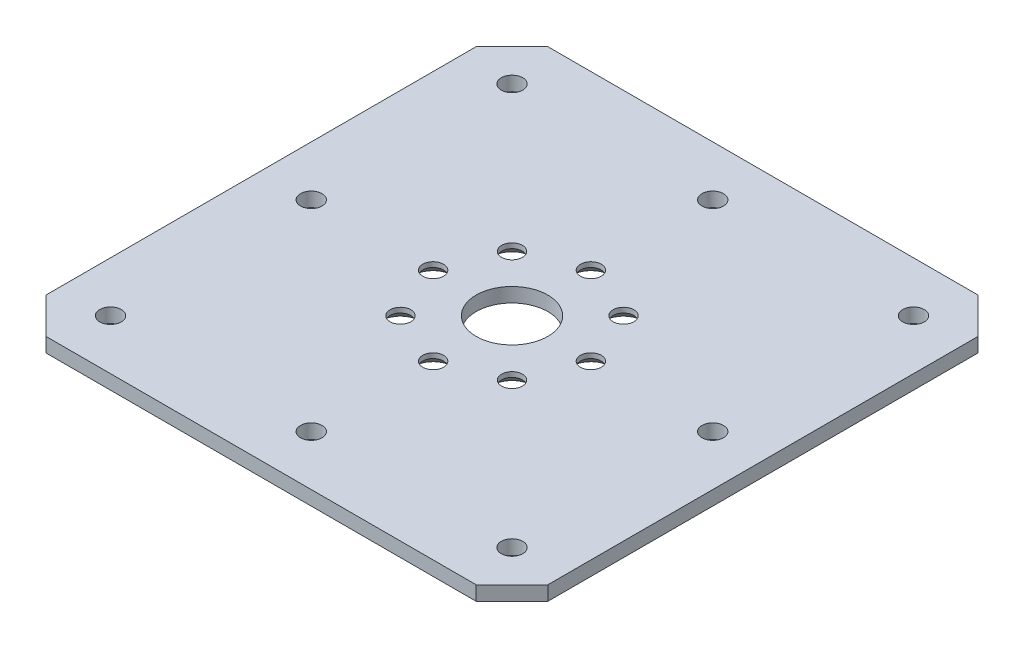
ISO-10303-21;
HEADER;
FILE_DESCRIPTION(('STEP AP214'),'2;1');
FILE_NAME('part.step','',(''),(''),'','','');
FILE_SCHEMA(('AUTOMOTIVE_DESIGN { 1 0 10303 214 1 1 1 1 }'));
ENDSEC;
DATA;
#1=APPLICATION_CONTEXT('core data for automotive mechanical design processes');
#2=APPLICATION_PROTOCOL_DEFINITION('international standard','automotive_design',2000,#1);
#3=PRODUCT_CONTEXT('',#1,'mechanical');
#4=PRODUCT('Part','Part','',(#3));
#5=PRODUCT_RELATED_PRODUCT_CATEGORY('part','',(#4));
#6=PRODUCT_DEFINITION_FORMATION('','',#4);
#7=PRODUCT_DEFINITION_CONTEXT('part definition',#1,'design');
#8=PRODUCT_DEFINITION('design','',#6,#7);
#9=PRODUCT_DEFINITION_SHAPE('','',#8);
#10=(LENGTH_UNIT() NAMED_UNIT(*) SI_UNIT(.MILLI.,.METRE.));
#11=(NAMED_UNIT(*) PLANE_ANGLE_UNIT() SI_UNIT($,.RADIAN.));
#12=(NAMED_UNIT(*) SI_UNIT($,.STERADIAN.) SOLID_ANGLE_UNIT());
#13=UNCERTAINTY_MEASURE_WITH_UNIT(LENGTH_MEASURE(1.E-05),#10,'distance_accuracy_value','');
#14=(GEOMETRIC_REPRESENTATION_CONTEXT(3) GLOBAL_UNCERTAINTY_ASSIGNED_CONTEXT((#13)) GLOBAL_UNIT_ASSIGNED_CONTEXT((#10,
#11,#12)) REPRESENTATION_CONTEXT('',''));
#15=CARTESIAN_POINT('',(0.,0.,0.));
#16=DIRECTION('',(0.,0.,1.));
#17=DIRECTION('',(1.,0.,0.));
#18=AXIS2_PLACEMENT_3D('',#15,#16,#17);
#19=CARTESIAN_POINT('',(-35.,-2.,70.));
#20=DIRECTION('',(0.,1.,0.));
#21=DIRECTION('',(0.,0.,1.));
#22=AXIS2_PLACEMENT_3D('',#19,#20,#21);
#23=PLANE('',#22);
#24=CARTESIAN_POINT('',(-28.,-2.,35.));
#25=DIRECTION('',(0.,1.,0.));
#26=DIRECTION('',(0.,0.,1.));
#27=AXIS2_PLACEMENT_3D('',#24,#25,#26);
#28=CIRCLE('',#27,1.5);
#29=CARTESIAN_POINT('',(-28.,-2.,36.5));
#30=VERTEX_POINT('',#29);
#31=EDGE_CURVE('E284',#30,#30,#28,.T.);
#32=ORIENTED_EDGE('',*,*,#31,.T.);
#33=EDGE_LOOP('',(#32));
#34=FACE_BOUND('',#33,.T.);
#35=CARTESIAN_POINT('',(-28.,-2.,63.));
#36=DIRECTION('',(0.,1.,0.));
#37=DIRECTION('',(0.,0.,1.));
#38=AXIS2_PLACEMENT_3D('',#35,#36,#37);
#39=CIRCLE('',#38,1.5);
#40=CARTESIAN_POINT('',(-28.,-2.,64.5));
#41=VERTEX_POINT('',#40);
#42=EDGE_CURVE('E278',#41,#41,#39,.T.);
#43=ORIENTED_EDGE('',*,*,#42,.T.);
#44=EDGE_LOOP('',(#43));
#45=FACE_BOUND('',#44,.T.);
#46=CARTESIAN_POINT('',(0.,-2.,63.));
#47=DIRECTION('',(0.,1.,0.));
#48=DIRECTION('',(0.,0.,1.));
#49=AXIS2_PLACEMENT_3D('',#46,#47,#48);
#50=CIRCLE('',#49,1.5);
#51=CARTESIAN_POINT('',(0.,-2.,64.5));
#52=VERTEX_POINT('',#51);
#53=EDGE_CURVE('E272',#52,#52,#50,.T.);
#54=ORIENTED_EDGE('',*,*,#53,.T.);
#55=EDGE_LOOP('',(#54));
#56=FACE_BOUND('',#55,.T.);
#57=CARTESIAN_POINT('',(28.,-2.,63.));
#58=DIRECTION('',(0.,1.,0.));
#59=DIRECTION('',(0.,0.,1.));
#60=AXIS2_PLACEMENT_3D('',#57,#58,#59);
#61=CIRCLE('',#60,1.5);
#62=CARTESIAN_POINT('',(28.,-2.,64.5));
#63=VERTEX_POINT('',#62);
#64=EDGE_CURVE('E266',#63,#63,#61,.T.);
#65=ORIENTED_EDGE('',*,*,#64,.T.);
#66=EDGE_LOOP('',(#65));
#67=FACE_BOUND('',#66,.T.);
#68=CARTESIAN_POINT('',(28.,-2.,35.));
#69=DIRECTION('',(0.,1.,0.));
#70=DIRECTION('',(0.,0.,1.));
#71=AXIS2_PLACEMENT_3D('',#68,#69,#70);
#72=CIRCLE('',#71,1.5);
#73=CARTESIAN_POINT('',(28.,-2.,36.5));
#74=VERTEX_POINT('',#73);
#75=EDGE_CURVE('E260',#74,#74,#72,.T.);
#76=ORIENTED_EDGE('',*,*,#75,.T.);
#77=EDGE_LOOP('',(#76));
#78=FACE_BOUND('',#77,.T.);
#79=CARTESIAN_POINT('',(28.,-2.,7.));
#80=DIRECTION('',(0.,1.,0.));
#81=DIRECTION('',(0.,0.,1.));
#82=AXIS2_PLACEMENT_3D('',#79,#80,#81);
#83=CIRCLE('',#82,1.5);
#84=CARTESIAN_POINT('',(28.,-2.,8.5));
#85=VERTEX_POINT('',#84);
#86=EDGE_CURVE('E254',#85,#85,#83,.T.);
#87=ORIENTED_EDGE('',*,*,#86,.T.);
#88=EDGE_LOOP('',(#87));
#89=FACE_BOUND('',#88,.T.);
#90=CARTESIAN_POINT('',(0.,-2.,7.));
#91=DIRECTION('',(0.,1.,0.));
#92=DIRECTION('',(0.,0.,1.));
#93=AXIS2_PLACEMENT_3D('',#90,#91,#92);
#94=CIRCLE('',#93,1.5);
#95=CARTESIAN_POINT('',(0.,-2.,8.5));
#96=VERTEX_POINT('',#95);
#97=EDGE_CURVE('E248',#96,#96,#94,.T.);
#98=ORIENTED_EDGE('',*,*,#97,.T.);
#99=EDGE_LOOP('',(#98));
#100=FACE_BOUND('',#99,.T.);
#101=CARTESIAN_POINT('',(-28.,-2.,7.));
#102=DIRECTION('',(0.,1.,0.));
#103=DIRECTION('',(0.,0.,1.));
#104=AXIS2_PLACEMENT_3D('',#101,#102,#103);
#105=CIRCLE('',#104,1.5);
#106=CARTESIAN_POINT('',(-28.,-2.,8.5));
#107=VERTEX_POINT('',#106);
#108=EDGE_CURVE('E244',#107,#107,#105,.T.);
#109=ORIENTED_EDGE('',*,*,#108,.T.);
#110=EDGE_LOOP('',(#109));
#111=FACE_BOUND('',#110,.T.);
#112=CARTESIAN_POINT('',(0.,-2.,46.));
#113=DIRECTION('',(0.,-1.,0.));
#114=DIRECTION('',(0.,0.,-1.));
#115=AXIS2_PLACEMENT_3D('',#112,#113,#114);
#116=CIRCLE('',#115,2.75);
#117=CARTESIAN_POINT('',(0.,-2.,43.25));
#118=VERTEX_POINT('',#117);
#119=EDGE_CURVE('E241',#118,#118,#116,.T.);
#120=ORIENTED_EDGE('',*,*,#119,.F.);
#121=EDGE_LOOP('',(#120));
#122=FACE_BOUND('',#121,.T.);
#123=CARTESIAN_POINT('',(-7.778174593052,-2.,42.778174593052));
#124=DIRECTION('',(0.,-1.,0.));
#125=DIRECTION('',(0.,0.,-1.));
#126=AXIS2_PLACEMENT_3D('',#123,#124,#125);
#127=CIRCLE('',#126,2.75);
#128=CARTESIAN_POINT('',(-7.778174593052,-2.,40.028174593052));
#129=VERTEX_POINT('',#128);
#130=EDGE_CURVE('E232',#129,#129,#127,.T.);
#131=ORIENTED_EDGE('',*,*,#130,.F.);
#132=EDGE_LOOP('',(#131));
#133=FACE_BOUND('',#132,.T.);
#134=CARTESIAN_POINT('',(-11.,-2.,35.));
#135=DIRECTION('',(0.,-1.,0.));
#136=DIRECTION('',(0.,0.,-1.));
#137=AXIS2_PLACEMENT_3D('',#134,#135,#136);
#138=CIRCLE('',#137,2.75);
#139=CARTESIAN_POINT('',(-11.,-2.,32.25));
#140=VERTEX_POINT('',#139);
#141=EDGE_CURVE('E223',#140,#140,#138,.T.);
#142=ORIENTED_EDGE('',*,*,#141,.F.);
#143=EDGE_LOOP('',(#142));
#144=FACE_BOUND('',#143,.T.);
#145=CARTESIAN_POINT('',(-7.778174593052,-2.,27.221825406948));
#146=DIRECTION('',(0.,-1.,0.));
#147=DIRECTION('',(0.,0.,-1.));
#148=AXIS2_PLACEMENT_3D('',#145,#146,#147);
#149=CIRCLE('',#148,2.75);
#150=CARTESIAN_POINT('',(-7.778174593052,-2.,24.471825406948));
#151=VERTEX_POINT('',#150);
#152=EDGE_CURVE('E214',#151,#151,#149,.T.);
#153=ORIENTED_EDGE('',*,*,#152,.F.);
#154=EDGE_LOOP('',(#153));
#155=FACE_BOUND('',#154,.T.);
#156=CARTESIAN_POINT('',(0.,-2.,24.));
#157=DIRECTION('',(0.,-1.,0.));
#158=DIRECTION('',(0.,0.,-1.));
#159=AXIS2_PLACEMENT_3D('',#156,#157,#158);
#160=CIRCLE('',#159,2.75);
#161=CARTESIAN_POINT('',(0.,-2.,21.25));
#162=VERTEX_POINT('',#161);
#163=EDGE_CURVE('E205',#162,#162,#160,.T.);
#164=ORIENTED_EDGE('',*,*,#163,.F.);
#165=EDGE_LOOP('',(#164));
#166=FACE_BOUND('',#165,.T.);
#167=CARTESIAN_POINT('',(7.778174593052,-2.,27.221825406948));
#168=DIRECTION('',(0.,-1.,0.));
#169=DIRECTION('',(0.,0.,-1.));
#170=AXIS2_PLACEMENT_3D('',#167,#168,#169);
#171=CIRCLE('',#170,2.75);
#172=CARTESIAN_POINT('',(7.778174593052,-2.,24.471825406948));
#173=VERTEX_POINT('',#172);
#174=EDGE_CURVE('E196',#173,#173,#171,.T.);
#175=ORIENTED_EDGE('',*,*,#174,.F.);
#176=EDGE_LOOP('',(#175));
#177=FACE_BOUND('',#176,.T.);
#178=CARTESIAN_POINT('',(11.,-2.,35.));
#179=DIRECTION('',(0.,-1.,0.));
#180=DIRECTION('',(0.,0.,-1.));
#181=AXIS2_PLACEMENT_3D('',#178,#179,#180);
#182=CIRCLE('',#181,2.75);
#183=CARTESIAN_POINT('',(11.,-2.,32.25));
#184=VERTEX_POINT('',#183);
#185=EDGE_CURVE('E187',#184,#184,#182,.T.);
#186=ORIENTED_EDGE('',*,*,#185,.F.);
#187=EDGE_LOOP('',(#186));
#188=FACE_BOUND('',#187,.T.);
#189=CARTESIAN_POINT('',(7.778174593052,-2.,42.778174593052));
#190=DIRECTION('',(0.,-1.,0.));
#191=DIRECTION('',(0.,0.,-1.));
#192=AXIS2_PLACEMENT_3D('',#189,#190,#191);
#193=CIRCLE('',#192,2.75);
#194=CARTESIAN_POINT('',(7.778174593052,-2.,40.028174593052));
#195=VERTEX_POINT('',#194);
#196=EDGE_CURVE('E178',#195,#195,#193,.T.);
#197=ORIENTED_EDGE('',*,*,#196,.F.);
#198=EDGE_LOOP('',(#197));
#199=FACE_BOUND('',#198,.T.);
#200=CARTESIAN_POINT('',(0.,-2.,35.));
#201=DIRECTION('',(0.,1.,0.));
#202=DIRECTION('',(0.,0.,1.));
#203=AXIS2_PLACEMENT_3D('',#200,#201,#202);
#204=CIRCLE('',#203,5.);
#205=CARTESIAN_POINT('',(0.,-2.,40.));
#206=VERTEX_POINT('',#205);
#207=EDGE_CURVE('E163',#206,#206,#204,.T.);
#208=ORIENTED_EDGE('',*,*,#207,.T.);
#209=EDGE_LOOP('',(#208));
#210=FACE_BOUND('',#209,.T.);
#211=DIRECTION('',(1.,0.,0.));
#212=VECTOR('',#211,1.);
#213=CARTESIAN_POINT('',(-35.,-2.,70.));
#214=LINE('',#213,#212);
#215=CARTESIAN_POINT('',(-30.,-2.,70.));
#216=VERTEX_POINT('',#215);
#217=CARTESIAN_POINT('',(30.,-2.,70.));
#218=VERTEX_POINT('',#217);
#219=EDGE_CURVE('E105',#216,#218,#214,.T.);
#220=ORIENTED_EDGE('',*,*,#219,.F.);
#221=DIRECTION('',(-0.707106781186549,0.,-0.707106781186547));
#222=VECTOR('',#221,1.);
#223=CARTESIAN_POINT('',(-35.,-2.,65.));
#224=LINE('',#223,#222);
#225=CARTESIAN_POINT('',(-35.,-2.,65.));
#226=VERTEX_POINT('',#225);
#227=EDGE_CURVE('E100',#216,#226,#224,.T.);
#228=ORIENTED_EDGE('',*,*,#227,.T.);
#229=DIRECTION('',(0.,0.,-1.));
#230=VECTOR('',#229,1.);
#231=CARTESIAN_POINT('',(-35.,-2.,70.));
#232=LINE('',#231,#230);
#233=CARTESIAN_POINT('',(-35.,-2.,5.00000000000005));
#234=VERTEX_POINT('',#233);
#235=EDGE_CURVE('E102',#226,#234,#232,.T.);
#236=ORIENTED_EDGE('',*,*,#235,.T.);
#237=DIRECTION('',(-0.707106781186547,0.,0.707106781186549));
#238=VECTOR('',#237,1.);
#239=CARTESIAN_POINT('',(-30.,-2.,0.));
#240=LINE('',#239,#238);
#241=CARTESIAN_POINT('',(-30.,-2.,0.));
#242=VERTEX_POINT('',#241);
#243=EDGE_CURVE('E141',#234,#242,#240,.F.);
#244=ORIENTED_EDGE('',*,*,#243,.T.);
#245=DIRECTION('',(1.,0.,0.));
#246=VECTOR('',#245,1.);
#247=CARTESIAN_POINT('',(-35.,-2.,0.));
#248=LINE('',#247,#246);
#249=CARTESIAN_POINT('',(30.,-2.,0.));
#250=VERTEX_POINT('',#249);
#251=EDGE_CURVE('E161',#242,#250,#248,.T.);
#252=ORIENTED_EDGE('',*,*,#251,.T.);
#253=DIRECTION('',(-0.707106781186547,0.,-0.707106781186549));
#254=VECTOR('',#253,1.);
#255=CARTESIAN_POINT('',(30.,-2.,0.));
#256=LINE('',#255,#254);
#257=CARTESIAN_POINT('',(35.,-2.,5.00000000000002));
#258=VERTEX_POINT('',#257);
#259=EDGE_CURVE('E49',#250,#258,#256,.F.);
#260=ORIENTED_EDGE('',*,*,#259,.T.);
#261=DIRECTION('',(0.,0.,-1.));
#262=VECTOR('',#261,1.);
#263=CARTESIAN_POINT('',(35.,-2.,70.));
#264=LINE('',#263,#262);
#265=CARTESIAN_POINT('',(35.,-2.,65.));
#266=VERTEX_POINT('',#265);
#267=EDGE_CURVE('E128',#266,#258,#264,.T.);
#268=ORIENTED_EDGE('',*,*,#267,.F.);
#269=DIRECTION('',(-0.707106781186549,0.,0.707106781186547));
#270=VECTOR('',#269,1.);
#271=CARTESIAN_POINT('',(35.,-2.,65.));
#272=LINE('',#271,#270);
#273=EDGE_CURVE('E57',#266,#218,#272,.T.);
#274=ORIENTED_EDGE('',*,*,#273,.T.);
#275=EDGE_LOOP('',(#220,#228,#236,#244,#252,#260,#268,#274));
#276=FACE_BOUND('',#275,.T.);
#277=ADVANCED_FACE('F34',(#34,#45,#56,#67,#78,#89,#100,#111,#122,#133,#144,#155,#166,#177,#188,
#199,#210,#276),#23,.F.);
#278=CARTESIAN_POINT('',(35.,0.,70.));
#279=DIRECTION('',(1.,0.,0.));
#280=DIRECTION('',(0.,0.,-1.));
#281=AXIS2_PLACEMENT_3D('',#278,#279,#280);
#282=PLANE('',#281);
#283=ORIENTED_EDGE('',*,*,#267,.T.);
#284=DIRECTION('',(0.,1.,0.));
#285=VECTOR('',#284,1.);
#286=CARTESIAN_POINT('',(35.,0.,5.00000000000002));
#287=LINE('',#286,#285);
#288=CARTESIAN_POINT('',(35.,0.,5.00000000000002));
#289=VERTEX_POINT('',#288);
#290=EDGE_CURVE('E11',#258,#289,#287,.T.);
#291=ORIENTED_EDGE('',*,*,#290,.T.);
#292=DIRECTION('',(0.,0.,-1.));
#293=VECTOR('',#292,1.);
#294=CARTESIAN_POINT('',(35.,0.,70.));
#295=LINE('',#294,#293);
#296=CARTESIAN_POINT('',(35.,0.,65.));
#297=VERTEX_POINT('',#296);
#298=EDGE_CURVE('E153',#297,#289,#295,.T.);
#299=ORIENTED_EDGE('',*,*,#298,.F.);
#300=DIRECTION('',(0.,-1.,0.));
#301=VECTOR('',#300,1.);
#302=CARTESIAN_POINT('',(35.,-2.,65.));
#303=LINE('',#302,#301);
#304=EDGE_CURVE('E42',#297,#266,#303,.T.);
#305=ORIENTED_EDGE('',*,*,#304,.T.);
#306=EDGE_LOOP('',(#283,#291,#299,#305));
#307=FACE_BOUND('',#306,.T.);
#308=ADVANCED_FACE('F150',(#307),#282,.T.);
#309=CARTESIAN_POINT('',(-35.,0.,70.));
#310=DIRECTION('',(0.,1.,0.));
#311=DIRECTION('',(0.,0.,1.));
#312=AXIS2_PLACEMENT_3D('',#309,#310,#311);
#313=PLANE('',#312);
#314=CARTESIAN_POINT('',(-28.,0.,35.));
#315=DIRECTION('',(0.,1.,0.));
#316=DIRECTION('',(0.,0.,1.));
#317=AXIS2_PLACEMENT_3D('',#314,#315,#316);
#318=CIRCLE('',#317,1.5);
#319=CARTESIAN_POINT('',(-28.,0.,36.5));
#320=VERTEX_POINT('',#319);
#321=EDGE_CURVE('E287',#320,#320,#318,.T.);
#322=ORIENTED_EDGE('',*,*,#321,.F.);
#323=EDGE_LOOP('',(#322));
#324=FACE_BOUND('',#323,.T.);
#325=CARTESIAN_POINT('',(-28.,0.,63.));
#326=DIRECTION('',(0.,1.,0.));
#327=DIRECTION('',(0.,0.,1.));
#328=AXIS2_PLACEMENT_3D('',#325,#326,#327);
#329=CIRCLE('',#328,1.5);
#330=CARTESIAN_POINT('',(-28.,0.,64.5));
#331=VERTEX_POINT('',#330);
#332=EDGE_CURVE('E281',#331,#331,#329,.T.);
#333=ORIENTED_EDGE('',*,*,#332,.F.);
#334=EDGE_LOOP('',(#333));
#335=FACE_BOUND('',#334,.T.);
#336=CARTESIAN_POINT('',(0.,0.,63.));
#337=DIRECTION('',(0.,1.,0.));
#338=DIRECTION('',(0.,0.,1.));
#339=AXIS2_PLACEMENT_3D('',#336,#337,#338);
#340=CIRCLE('',#339,1.5);
#341=CARTESIAN_POINT('',(0.,0.,64.5));
#342=VERTEX_POINT('',#341);
#343=EDGE_CURVE('E275',#342,#342,#340,.T.);
#344=ORIENTED_EDGE('',*,*,#343,.F.);
#345=EDGE_LOOP('',(#344));
#346=FACE_BOUND('',#345,.T.);
#347=CARTESIAN_POINT('',(28.,0.,63.));
#348=DIRECTION('',(0.,1.,0.));
#349=DIRECTION('',(0.,0.,1.));
#350=AXIS2_PLACEMENT_3D('',#347,#348,#349);
#351=CIRCLE('',#350,1.5);
#352=CARTESIAN_POINT('',(28.,0.,64.5));
#353=VERTEX_POINT('',#352);
#354=EDGE_CURVE('E269',#353,#353,#351,.T.);
#355=ORIENTED_EDGE('',*,*,#354,.F.);
#356=EDGE_LOOP('',(#355));
#357=FACE_BOUND('',#356,.T.);
#358=CARTESIAN_POINT('',(28.,0.,35.));
#359=DIRECTION('',(0.,1.,0.));
#360=DIRECTION('',(0.,0.,1.));
#361=AXIS2_PLACEMENT_3D('',#358,#359,#360);
#362=CIRCLE('',#361,1.5);
#363=CARTESIAN_POINT('',(28.,0.,36.5));
#364=VERTEX_POINT('',#363);
#365=EDGE_CURVE('E263',#364,#364,#362,.T.);
#366=ORIENTED_EDGE('',*,*,#365,.F.);
#367=EDGE_LOOP('',(#366));
#368=FACE_BOUND('',#367,.T.);
#369=CARTESIAN_POINT('',(28.,0.,7.));
#370=DIRECTION('',(0.,1.,0.));
#371=DIRECTION('',(0.,0.,1.));
#372=AXIS2_PLACEMENT_3D('',#369,#370,#371);
#373=CIRCLE('',#372,1.5);
#374=CARTESIAN_POINT('',(28.,0.,8.5));
#375=VERTEX_POINT('',#374);
#376=EDGE_CURVE('E257',#375,#375,#373,.T.);
#377=ORIENTED_EDGE('',*,*,#376,.F.);
#378=EDGE_LOOP('',(#377));
#379=FACE_BOUND('',#378,.T.);
#380=CARTESIAN_POINT('',(0.,0.,7.));
#381=DIRECTION('',(0.,1.,0.));
#382=DIRECTION('',(0.,0.,1.));
#383=AXIS2_PLACEMENT_3D('',#380,#381,#382);
#384=CIRCLE('',#383,1.5);
#385=CARTESIAN_POINT('',(0.,0.,8.5));
#386=VERTEX_POINT('',#385);
#387=EDGE_CURVE('E251',#386,#386,#384,.T.);
#388=ORIENTED_EDGE('',*,*,#387,.F.);
#389=EDGE_LOOP('',(#388));
#390=FACE_BOUND('',#389,.T.);
#391=CARTESIAN_POINT('',(-28.,0.,7.));
#392=DIRECTION('',(0.,1.,0.));
#393=DIRECTION('',(0.,0.,1.));
#394=AXIS2_PLACEMENT_3D('',#391,#392,#393);
#395=CIRCLE('',#394,1.5);
#396=CARTESIAN_POINT('',(-28.,0.,8.5));
#397=VERTEX_POINT('',#396);
#398=EDGE_CURVE('E245',#397,#397,#395,.T.);
#399=ORIENTED_EDGE('',*,*,#398,.F.);
#400=EDGE_LOOP('',(#399));
#401=FACE_BOUND('',#400,.T.);
#402=CARTESIAN_POINT('',(0.,0.,46.));
#403=DIRECTION('',(0.,-1.,0.));
#404=DIRECTION('',(0.,0.,-1.));
#405=AXIS2_PLACEMENT_3D('',#402,#403,#404);
#406=CIRCLE('',#405,1.45);
#407=CARTESIAN_POINT('',(0.,0.,44.55));
#408=VERTEX_POINT('',#407);
#409=EDGE_CURVE('E235',#408,#408,#406,.T.);
#410=ORIENTED_EDGE('',*,*,#409,.T.);
#411=EDGE_LOOP('',(#410));
#412=FACE_BOUND('',#411,.T.);
#413=CARTESIAN_POINT('',(-7.778174593052,0.,42.778174593052));
#414=DIRECTION('',(0.,-1.,0.));
#415=DIRECTION('',(0.,0.,-1.));
#416=AXIS2_PLACEMENT_3D('',#413,#414,#415);
#417=CIRCLE('',#416,1.45);
#418=CARTESIAN_POINT('',(-7.778174593052,0.,41.328174593052));
#419=VERTEX_POINT('',#418);
#420=EDGE_CURVE('E226',#419,#419,#417,.T.);
#421=ORIENTED_EDGE('',*,*,#420,.T.);
#422=EDGE_LOOP('',(#421));
#423=FACE_BOUND('',#422,.T.);
#424=CARTESIAN_POINT('',(-11.,0.,35.));
#425=DIRECTION('',(0.,-1.,0.));
#426=DIRECTION('',(0.,0.,-1.));
#427=AXIS2_PLACEMENT_3D('',#424,#425,#426);
#428=CIRCLE('',#427,1.45);
#429=CARTESIAN_POINT('',(-11.,0.,33.55));
#430=VERTEX_POINT('',#429);
#431=EDGE_CURVE('E217',#430,#430,#428,.T.);
#432=ORIENTED_EDGE('',*,*,#431,.T.);
#433=EDGE_LOOP('',(#432));
#434=FACE_BOUND('',#433,.T.);
#435=CARTESIAN_POINT('',(-7.778174593052,0.,27.221825406948));
#436=DIRECTION('',(0.,-1.,0.));
#437=DIRECTION('',(0.,0.,-1.));
#438=AXIS2_PLACEMENT_3D('',#435,#436,#437);
#439=CIRCLE('',#438,1.45);
#440=CARTESIAN_POINT('',(-7.778174593052,0.,25.771825406948));
#441=VERTEX_POINT('',#440);
#442=EDGE_CURVE('E208',#441,#441,#439,.T.);
#443=ORIENTED_EDGE('',*,*,#442,.T.);
#444=EDGE_LOOP('',(#443));
#445=FACE_BOUND('',#444,.T.);
#446=CARTESIAN_POINT('',(0.,0.,24.));
#447=DIRECTION('',(0.,-1.,0.));
#448=DIRECTION('',(0.,0.,-1.));
#449=AXIS2_PLACEMENT_3D('',#446,#447,#448);
#450=CIRCLE('',#449,1.45);
#451=CARTESIAN_POINT('',(0.,0.,22.55));
#452=VERTEX_POINT('',#451);
#453=EDGE_CURVE('E199',#452,#452,#450,.T.);
#454=ORIENTED_EDGE('',*,*,#453,.T.);
#455=EDGE_LOOP('',(#454));
#456=FACE_BOUND('',#455,.T.);
#457=CARTESIAN_POINT('',(7.778174593052,0.,27.221825406948));
#458=DIRECTION('',(0.,-1.,0.));
#459=DIRECTION('',(0.,0.,-1.));
#460=AXIS2_PLACEMENT_3D('',#457,#458,#459);
#461=CIRCLE('',#460,1.45);
#462=CARTESIAN_POINT('',(7.778174593052,0.,25.771825406948));
#463=VERTEX_POINT('',#462);
#464=EDGE_CURVE('E190',#463,#463,#461,.T.);
#465=ORIENTED_EDGE('',*,*,#464,.T.);
#466=EDGE_LOOP('',(#465));
#467=FACE_BOUND('',#466,.T.);
#468=CARTESIAN_POINT('',(11.,0.,35.));
#469=DIRECTION('',(0.,-1.,0.));
#470=DIRECTION('',(0.,0.,-1.));
#471=AXIS2_PLACEMENT_3D('',#468,#469,#470);
#472=CIRCLE('',#471,1.45);
#473=CARTESIAN_POINT('',(11.,0.,33.55));
#474=VERTEX_POINT('',#473);
#475=EDGE_CURVE('E181',#474,#474,#472,.T.);
#476=ORIENTED_EDGE('',*,*,#475,.T.);
#477=EDGE_LOOP('',(#476));
#478=FACE_BOUND('',#477,.T.);
#479=CARTESIAN_POINT('',(7.778174593052,0.,42.778174593052));
#480=DIRECTION('',(0.,-1.,0.));
#481=DIRECTION('',(0.,0.,-1.));
#482=AXIS2_PLACEMENT_3D('',#479,#480,#481);
#483=CIRCLE('',#482,1.45);
#484=CARTESIAN_POINT('',(7.778174593052,0.,41.328174593052));
#485=VERTEX_POINT('',#484);
#486=EDGE_CURVE('E170',#485,#485,#483,.T.);
#487=ORIENTED_EDGE('',*,*,#486,.T.);
#488=EDGE_LOOP('',(#487));
#489=FACE_BOUND('',#488,.T.);
#490=CARTESIAN_POINT('',(0.,0.,35.));
#491=DIRECTION('',(0.,1.,0.));
#492=DIRECTION('',(0.,0.,1.));
#493=AXIS2_PLACEMENT_3D('',#490,#491,#492);
#494=CIRCLE('',#493,5.);
#495=CARTESIAN_POINT('',(0.,0.,40.));
#496=VERTEX_POINT('',#495);
#497=EDGE_CURVE('E167',#496,#496,#494,.T.);
#498=ORIENTED_EDGE('',*,*,#497,.F.);
#499=EDGE_LOOP('',(#498));
#500=FACE_BOUND('',#499,.T.);
#501=DIRECTION('',(0.,0.,-1.));
#502=VECTOR('',#501,1.);
#503=CARTESIAN_POINT('',(-35.,0.,70.));
#504=LINE('',#503,#502);
#505=CARTESIAN_POINT('',(-35.,0.,65.));
#506=VERTEX_POINT('',#505);
#507=CARTESIAN_POINT('',(-35.,0.,5.00000000000002));
#508=VERTEX_POINT('',#507);
#509=EDGE_CURVE('E119',#506,#508,#504,.T.);
#510=ORIENTED_EDGE('',*,*,#509,.F.);
#511=DIRECTION('',(0.707106781186549,0.,0.707106781186547));
#512=VECTOR('',#511,1.);
#513=CARTESIAN_POINT('',(-32.5,0.,67.5));
#514=LINE('',#513,#512);
#515=CARTESIAN_POINT('',(-30.,0.,70.));
#516=VERTEX_POINT('',#515);
#517=EDGE_CURVE('E123',#506,#516,#514,.T.);
#518=ORIENTED_EDGE('',*,*,#517,.T.);
#519=DIRECTION('',(1.,0.,0.));
#520=VECTOR('',#519,1.);
#521=CARTESIAN_POINT('',(-35.,0.,70.));
#522=LINE('',#521,#520);
#523=CARTESIAN_POINT('',(30.,0.,70.));
#524=VERTEX_POINT('',#523);
#525=EDGE_CURVE('E120',#516,#524,#522,.T.);
#526=ORIENTED_EDGE('',*,*,#525,.T.);
#527=DIRECTION('',(0.707106781186549,0.,-0.707106781186547));
#528=VECTOR('',#527,1.);
#529=CARTESIAN_POINT('',(-2.5000000000001,0.,102.5));
#530=LINE('',#529,#528);
#531=EDGE_CURVE('E124',#524,#297,#530,.T.);
#532=ORIENTED_EDGE('',*,*,#531,.T.);
#533=ORIENTED_EDGE('',*,*,#298,.T.);
#534=DIRECTION('',(0.707106781186547,0.,0.707106781186549));
#535=VECTOR('',#534,1.);
#536=CARTESIAN_POINT('',(32.5000000000001,0.,2.50000000000009));
#537=LINE('',#536,#535);
#538=CARTESIAN_POINT('',(30.,0.,0.));
#539=VERTEX_POINT('',#538);
#540=EDGE_CURVE('E133',#289,#539,#537,.F.);
#541=ORIENTED_EDGE('',*,*,#540,.T.);
#542=DIRECTION('',(1.,0.,0.));
#543=VECTOR('',#542,1.);
#544=CARTESIAN_POINT('',(-35.,0.,0.));
#545=LINE('',#544,#543);
#546=CARTESIAN_POINT('',(-30.,0.,0.));
#547=VERTEX_POINT('',#546);
#548=EDGE_CURVE('E158',#547,#539,#545,.T.);
#549=ORIENTED_EDGE('',*,*,#548,.F.);
#550=DIRECTION('',(0.707106781186547,0.,-0.707106781186549));
#551=VECTOR('',#550,1.);
#552=CARTESIAN_POINT('',(-67.5,0.,37.5000000000001));
#553=LINE('',#552,#551);
#554=EDGE_CURVE('E126',#547,#508,#553,.F.);
#555=ORIENTED_EDGE('',*,*,#554,.T.);
#556=EDGE_LOOP('',(#510,#518,#526,#532,#533,#541,#549,#555));
#557=FACE_BOUND('',#556,.T.);
#558=ADVANCED_FACE('F302',(#324,#335,#346,#357,#368,#379,#390,#401,#412,#423,#434,#445,#456,
#467,#478,#489,#500,#557),#313,.T.);
#559=CARTESIAN_POINT('',(-35.,-2.,70.));
#560=DIRECTION('',(-1.,0.,0.));
#561=DIRECTION('',(0.,0.,1.));
#562=AXIS2_PLACEMENT_3D('',#559,#560,#561);
#563=PLANE('',#562);
#564=ORIENTED_EDGE('',*,*,#235,.F.);
#565=DIRECTION('',(0.,1.,0.));
#566=VECTOR('',#565,1.);
#567=CARTESIAN_POINT('',(-35.,0.,65.));
#568=LINE('',#567,#566);
#569=EDGE_CURVE('E115',#226,#506,#568,.T.);
#570=ORIENTED_EDGE('',*,*,#569,.T.);
#571=ORIENTED_EDGE('',*,*,#509,.T.);
#572=DIRECTION('',(0.,-1.,0.));
#573=VECTOR('',#572,1.);
#574=CARTESIAN_POINT('',(-35.,-2.,5.00000000000002));
#575=LINE('',#574,#573);
#576=EDGE_CURVE('E118',#508,#234,#575,.T.);
#577=ORIENTED_EDGE('',*,*,#576,.T.);
#578=EDGE_LOOP('',(#564,#570,#571,#577));
#579=FACE_BOUND('',#578,.T.);
#580=ADVANCED_FACE('F113',(#579),#563,.T.);
#581=CARTESIAN_POINT('',(35.,-2.,70.));
#582=DIRECTION('',(0.,0.,-1.));
#583=DIRECTION('',(-1.,0.,0.));
#584=AXIS2_PLACEMENT_3D('',#581,#582,#583);
#585=PLANE('',#584);
#586=ORIENTED_EDGE('',*,*,#525,.F.);
#587=DIRECTION('',(0.,-1.,0.));
#588=VECTOR('',#587,1.);
#589=CARTESIAN_POINT('',(-30.,-2.,70.));
#590=LINE('',#589,#588);
#591=EDGE_CURVE('E138',#516,#216,#590,.T.);
#592=ORIENTED_EDGE('',*,*,#591,.T.);
#593=ORIENTED_EDGE('',*,*,#219,.T.);
#594=DIRECTION('',(0.,1.,0.));
#595=VECTOR('',#594,1.);
#596=CARTESIAN_POINT('',(30.,0.,70.));
#597=LINE('',#596,#595);
#598=EDGE_CURVE('E136',#218,#524,#597,.T.);
#599=ORIENTED_EDGE('',*,*,#598,.T.);
#600=EDGE_LOOP('',(#586,#592,#593,#599));
#601=FACE_BOUND('',#600,.T.);
#602=ADVANCED_FACE('F351',(#601),#585,.F.);
#603=CARTESIAN_POINT('',(35.,-2.,0.));
#604=DIRECTION('',(0.,0.,-1.));
#605=DIRECTION('',(-1.,0.,0.));
#606=AXIS2_PLACEMENT_3D('',#603,#604,#605);
#607=PLANE('',#606);
#608=ORIENTED_EDGE('',*,*,#548,.T.);
#609=DIRECTION('',(0.,-1.,0.));
#610=VECTOR('',#609,1.);
#611=CARTESIAN_POINT('',(30.,-2.,0.));
#612=LINE('',#611,#610);
#613=EDGE_CURVE('E146',#539,#250,#612,.T.);
#614=ORIENTED_EDGE('',*,*,#613,.T.);
#615=ORIENTED_EDGE('',*,*,#251,.F.);
#616=DIRECTION('',(0.,1.,0.));
#617=VECTOR('',#616,1.);
#618=CARTESIAN_POINT('',(-30.,-2.,0.));
#619=LINE('',#618,#617);
#620=EDGE_CURVE('E109',#242,#547,#619,.T.);
#621=ORIENTED_EDGE('',*,*,#620,.T.);
#622=EDGE_LOOP('',(#608,#614,#615,#621));
#623=FACE_BOUND('',#622,.T.);
#624=ADVANCED_FACE('F345',(#623),#607,.T.);
#625=CARTESIAN_POINT('',(0.,-2.,35.));
#626=DIRECTION('',(0.,1.,0.));
#627=DIRECTION('',(0.,0.,1.));
#628=AXIS2_PLACEMENT_3D('',#625,#626,#627);
#629=CYLINDRICAL_SURFACE('',#628,5.);
#630=ORIENTED_EDGE('',*,*,#207,.F.);
#631=EDGE_LOOP('',(#630));
#632=FACE_BOUND('',#631,.T.);
#633=ORIENTED_EDGE('',*,*,#497,.T.);
#634=EDGE_LOOP('',(#633));
#635=FACE_BOUND('',#634,.T.);
#636=ADVANCED_FACE('F358',(#632,#635),#629,.F.);
#637=CARTESIAN_POINT('',(-35.,-2.,65.));
#638=DIRECTION('',(-0.707106781186547,0.,0.707106781186549));
#639=DIRECTION('',(0.707106781186549,0.,0.707106781186547));
#640=AXIS2_PLACEMENT_3D('',#637,#638,#639);
#641=PLANE('',#640);
#642=ORIENTED_EDGE('',*,*,#227,.F.);
#643=ORIENTED_EDGE('',*,*,#591,.F.);
#644=ORIENTED_EDGE('',*,*,#517,.F.);
#645=ORIENTED_EDGE('',*,*,#569,.F.);
#646=EDGE_LOOP('',(#642,#643,#644,#645));
#647=FACE_BOUND('',#646,.T.);
#648=ADVANCED_FACE('F122',(#647),#641,.T.);
#649=CARTESIAN_POINT('',(30.,-2.,0.));
#650=DIRECTION('',(-0.707106781186549,0.,0.707106781186547));
#651=DIRECTION('',(0.707106781186547,0.,0.707106781186549));
#652=AXIS2_PLACEMENT_3D('',#649,#650,#651);
#653=PLANE('',#652);
#654=ORIENTED_EDGE('',*,*,#540,.F.);
#655=ORIENTED_EDGE('',*,*,#290,.F.);
#656=ORIENTED_EDGE('',*,*,#259,.F.);
#657=ORIENTED_EDGE('',*,*,#613,.F.);
#658=EDGE_LOOP('',(#654,#655,#656,#657));
#659=FACE_BOUND('',#658,.T.);
#660=ADVANCED_FACE('F349',(#659),#653,.F.);
#661=CARTESIAN_POINT('',(-30.,-2.,0.));
#662=DIRECTION('',(0.707106781186549,0.,0.707106781186547));
#663=DIRECTION('',(0.707106781186547,0.,-0.707106781186549));
#664=AXIS2_PLACEMENT_3D('',#661,#662,#663);
#665=PLANE('',#664);
#666=ORIENTED_EDGE('',*,*,#243,.F.);
#667=ORIENTED_EDGE('',*,*,#576,.F.);
#668=ORIENTED_EDGE('',*,*,#554,.F.);
#669=ORIENTED_EDGE('',*,*,#620,.F.);
#670=EDGE_LOOP('',(#666,#667,#668,#669));
#671=FACE_BOUND('',#670,.T.);
#672=ADVANCED_FACE('F341',(#671),#665,.F.);
#673=CARTESIAN_POINT('',(35.,0.,65.));
#674=DIRECTION('',(0.707106781186547,0.,0.707106781186549));
#675=DIRECTION('',(0.707106781186549,0.,-0.707106781186547));
#676=AXIS2_PLACEMENT_3D('',#673,#674,#675);
#677=PLANE('',#676);
#678=ORIENTED_EDGE('',*,*,#531,.F.);
#679=ORIENTED_EDGE('',*,*,#598,.F.);
#680=ORIENTED_EDGE('',*,*,#273,.F.);
#681=ORIENTED_EDGE('',*,*,#304,.F.);
#682=EDGE_LOOP('',(#678,#679,#680,#681));
#683=FACE_BOUND('',#682,.T.);
#684=ADVANCED_FACE('F36',(#683),#677,.T.);
#685=CARTESIAN_POINT('',(7.778174593052,-2.,42.778174593052));
#686=DIRECTION('',(0.,-1.,0.));
#687=DIRECTION('',(0.,0.,-1.));
#688=AXIS2_PLACEMENT_3D('',#685,#686,#687);
#689=CYLINDRICAL_SURFACE('',#688,1.45);
#690=ORIENTED_EDGE('',*,*,#486,.F.);
#691=EDGE_LOOP('',(#690));
#692=FACE_BOUND('',#691,.T.);
#693=CARTESIAN_POINT('',(7.778174593052,-0.7,42.778174593052));
#694=DIRECTION('',(0.,-1.,0.));
#695=DIRECTION('',(0.,0.,-1.));
#696=AXIS2_PLACEMENT_3D('',#693,#694,#695);
#697=CIRCLE('',#696,1.45);
#698=CARTESIAN_POINT('',(7.778174593052,-0.7,41.328174593052));
#699=VERTEX_POINT('',#698);
#700=EDGE_CURVE('E175',#699,#699,#697,.T.);
#701=ORIENTED_EDGE('',*,*,#700,.T.);
#702=EDGE_LOOP('',(#701));
#703=FACE_BOUND('',#702,.T.);
#704=ADVANCED_FACE('F376',(#692,#703),#689,.F.);
#705=CARTESIAN_POINT('',(7.778174593052,-2.,42.778174593052));
#706=DIRECTION('',(0.,-1.,0.));
#707=DIRECTION('',(0.,0.,-1.));
#708=AXIS2_PLACEMENT_3D('',#705,#706,#707);
#709=CONICAL_SURFACE('',#708,2.75,0.785398163397449);
#710=ORIENTED_EDGE('',*,*,#700,.F.);
#711=EDGE_LOOP('',(#710));
#712=FACE_BOUND('',#711,.T.);
#713=ORIENTED_EDGE('',*,*,#196,.T.);
#714=EDGE_LOOP('',(#713));
#715=FACE_BOUND('',#714,.T.);
#716=ADVANCED_FACE('F380',(#712,#715),#709,.F.);
#717=CARTESIAN_POINT('',(11.,-2.,35.));
#718=DIRECTION('',(0.,-1.,0.));
#719=DIRECTION('',(0.,0.,-1.));
#720=AXIS2_PLACEMENT_3D('',#717,#718,#719);
#721=CYLINDRICAL_SURFACE('',#720,1.45);
#722=ORIENTED_EDGE('',*,*,#475,.F.);
#723=EDGE_LOOP('',(#722));
#724=FACE_BOUND('',#723,.T.);
#725=CARTESIAN_POINT('',(11.,-0.7,35.));
#726=DIRECTION('',(0.,-1.,0.));
#727=DIRECTION('',(0.,0.,-1.));
#728=AXIS2_PLACEMENT_3D('',#725,#726,#727);
#729=CIRCLE('',#728,1.45);
#730=CARTESIAN_POINT('',(11.,-0.7,33.55));
#731=VERTEX_POINT('',#730);
#732=EDGE_CURVE('E184',#731,#731,#729,.T.);
#733=ORIENTED_EDGE('',*,*,#732,.T.);
#734=EDGE_LOOP('',(#733));
#735=FACE_BOUND('',#734,.T.);
#736=ADVANCED_FACE('F386',(#724,#735),#721,.F.);
#737=CARTESIAN_POINT('',(11.,-2.,35.));
#738=DIRECTION('',(0.,-1.,0.));
#739=DIRECTION('',(0.,0.,-1.));
#740=AXIS2_PLACEMENT_3D('',#737,#738,#739);
#741=CONICAL_SURFACE('',#740,2.75,0.785398163397448);
#742=ORIENTED_EDGE('',*,*,#732,.F.);
#743=EDGE_LOOP('',(#742));
#744=FACE_BOUND('',#743,.T.);
#745=ORIENTED_EDGE('',*,*,#185,.T.);
#746=EDGE_LOOP('',(#745));
#747=FACE_BOUND('',#746,.T.);
#748=ADVANCED_FACE('F436',(#744,#747),#741,.F.);
#749=CARTESIAN_POINT('',(7.778174593052,-2.,27.221825406948));
#750=DIRECTION('',(0.,-1.,0.));
#751=DIRECTION('',(0.,0.,-1.));
#752=AXIS2_PLACEMENT_3D('',#749,#750,#751);
#753=CYLINDRICAL_SURFACE('',#752,1.45);
#754=ORIENTED_EDGE('',*,*,#464,.F.);
#755=EDGE_LOOP('',(#754));
#756=FACE_BOUND('',#755,.T.);
#757=CARTESIAN_POINT('',(7.778174593052,-0.7,27.221825406948));
#758=DIRECTION('',(0.,-1.,0.));
#759=DIRECTION('',(0.,0.,-1.));
#760=AXIS2_PLACEMENT_3D('',#757,#758,#759);
#761=CIRCLE('',#760,1.45);
#762=CARTESIAN_POINT('',(7.778174593052,-0.7,25.771825406948));
#763=VERTEX_POINT('',#762);
#764=EDGE_CURVE('E193',#763,#763,#761,.T.);
#765=ORIENTED_EDGE('',*,*,#764,.T.);
#766=EDGE_LOOP('',(#765));
#767=FACE_BOUND('',#766,.T.);
#768=ADVANCED_FACE('F445',(#756,#767),#753,.F.);
#769=CARTESIAN_POINT('',(7.778174593052,-2.,27.221825406948));
#770=DIRECTION('',(0.,-1.,0.));
#771=DIRECTION('',(0.,0.,-1.));
#772=AXIS2_PLACEMENT_3D('',#769,#770,#771);
#773=CONICAL_SURFACE('',#772,2.75,0.785398163397449);
#774=ORIENTED_EDGE('',*,*,#764,.F.);
#775=EDGE_LOOP('',(#774));
#776=FACE_BOUND('',#775,.T.);
#777=ORIENTED_EDGE('',*,*,#174,.T.);
#778=EDGE_LOOP('',(#777));
#779=FACE_BOUND('',#778,.T.);
#780=ADVANCED_FACE('F455',(#776,#779),#773,.F.);
#781=CARTESIAN_POINT('',(0.,-2.,24.));
#782=DIRECTION('',(0.,-1.,0.));
#783=DIRECTION('',(0.,0.,-1.));
#784=AXIS2_PLACEMENT_3D('',#781,#782,#783);
#785=CYLINDRICAL_SURFACE('',#784,1.45);
#786=ORIENTED_EDGE('',*,*,#453,.F.);
#787=EDGE_LOOP('',(#786));
#788=FACE_BOUND('',#787,.T.);
#789=CARTESIAN_POINT('',(0.,-0.7,24.));
#790=DIRECTION('',(0.,-1.,0.));
#791=DIRECTION('',(0.,0.,-1.));
#792=AXIS2_PLACEMENT_3D('',#789,#790,#791);
#793=CIRCLE('',#792,1.45);
#794=CARTESIAN_POINT('',(0.,-0.7,22.55));
#795=VERTEX_POINT('',#794);
#796=EDGE_CURVE('E202',#795,#795,#793,.T.);
#797=ORIENTED_EDGE('',*,*,#796,.T.);
#798=EDGE_LOOP('',(#797));
#799=FACE_BOUND('',#798,.T.);
#800=ADVANCED_FACE('F465',(#788,#799),#785,.F.);
#801=CARTESIAN_POINT('',(0.,-2.,24.));
#802=DIRECTION('',(0.,-1.,0.));
#803=DIRECTION('',(0.,0.,-1.));
#804=AXIS2_PLACEMENT_3D('',#801,#802,#803);
#805=CONICAL_SURFACE('',#804,2.75,0.785398163397448);
#806=ORIENTED_EDGE('',*,*,#796,.F.);
#807=EDGE_LOOP('',(#806));
#808=FACE_BOUND('',#807,.T.);
#809=ORIENTED_EDGE('',*,*,#163,.T.);
#810=EDGE_LOOP('',(#809));
#811=FACE_BOUND('',#810,.T.);
#812=ADVANCED_FACE('F475',(#808,#811),#805,.F.);
#813=CARTESIAN_POINT('',(-7.778174593052,-2.,27.221825406948));
#814=DIRECTION('',(0.,-1.,0.));
#815=DIRECTION('',(0.,0.,-1.));
#816=AXIS2_PLACEMENT_3D('',#813,#814,#815);
#817=CYLINDRICAL_SURFACE('',#816,1.45);
#818=ORIENTED_EDGE('',*,*,#442,.F.);
#819=EDGE_LOOP('',(#818));
#820=FACE_BOUND('',#819,.T.);
#821=CARTESIAN_POINT('',(-7.778174593052,-0.7,27.221825406948));
#822=DIRECTION('',(0.,-1.,0.));
#823=DIRECTION('',(0.,0.,-1.));
#824=AXIS2_PLACEMENT_3D('',#821,#822,#823);
#825=CIRCLE('',#824,1.45);
#826=CARTESIAN_POINT('',(-7.778174593052,-0.7,25.771825406948));
#827=VERTEX_POINT('',#826);
#828=EDGE_CURVE('E211',#827,#827,#825,.T.);
#829=ORIENTED_EDGE('',*,*,#828,.T.);
#830=EDGE_LOOP('',(#829));
#831=FACE_BOUND('',#830,.T.);
#832=ADVANCED_FACE('F485',(#820,#831),#817,.F.);
#833=CARTESIAN_POINT('',(-7.778174593052,-2.,27.221825406948));
#834=DIRECTION('',(0.,-1.,0.));
#835=DIRECTION('',(0.,0.,-1.));
#836=AXIS2_PLACEMENT_3D('',#833,#834,#835);
#837=CONICAL_SURFACE('',#836,2.75,0.785398163397448);
#838=ORIENTED_EDGE('',*,*,#828,.F.);
#839=EDGE_LOOP('',(#838));
#840=FACE_BOUND('',#839,.T.);
#841=ORIENTED_EDGE('',*,*,#152,.T.);
#842=EDGE_LOOP('',(#841));
#843=FACE_BOUND('',#842,.T.);
#844=ADVANCED_FACE('F495',(#840,#843),#837,.F.);
#845=CARTESIAN_POINT('',(-11.,-2.,35.));
#846=DIRECTION('',(0.,-1.,0.));
#847=DIRECTION('',(0.,0.,-1.));
#848=AXIS2_PLACEMENT_3D('',#845,#846,#847);
#849=CYLINDRICAL_SURFACE('',#848,1.45);
#850=ORIENTED_EDGE('',*,*,#431,.F.);
#851=EDGE_LOOP('',(#850));
#852=FACE_BOUND('',#851,.T.);
#853=CARTESIAN_POINT('',(-11.,-0.7,35.));
#854=DIRECTION('',(0.,-1.,0.));
#855=DIRECTION('',(0.,0.,-1.));
#856=AXIS2_PLACEMENT_3D('',#853,#854,#855);
#857=CIRCLE('',#856,1.45);
#858=CARTESIAN_POINT('',(-11.,-0.7,33.55));
#859=VERTEX_POINT('',#858);
#860=EDGE_CURVE('E220',#859,#859,#857,.T.);
#861=ORIENTED_EDGE('',*,*,#860,.T.);
#862=EDGE_LOOP('',(#861));
#863=FACE_BOUND('',#862,.T.);
#864=ADVANCED_FACE('F505',(#852,#863),#849,.F.);
#865=CARTESIAN_POINT('',(-11.,-2.,35.));
#866=DIRECTION('',(0.,-1.,0.));
#867=DIRECTION('',(0.,0.,-1.));
#868=AXIS2_PLACEMENT_3D('',#865,#866,#867);
#869=CONICAL_SURFACE('',#868,2.75,0.785398163397448);
#870=ORIENTED_EDGE('',*,*,#860,.F.);
#871=EDGE_LOOP('',(#870));
#872=FACE_BOUND('',#871,.T.);
#873=ORIENTED_EDGE('',*,*,#141,.T.);
#874=EDGE_LOOP('',(#873));
#875=FACE_BOUND('',#874,.T.);
#876=ADVANCED_FACE('F515',(#872,#875),#869,.F.);
#877=CARTESIAN_POINT('',(-7.778174593052,-2.,42.778174593052));
#878=DIRECTION('',(0.,-1.,0.));
#879=DIRECTION('',(0.,0.,-1.));
#880=AXIS2_PLACEMENT_3D('',#877,#878,#879);
#881=CYLINDRICAL_SURFACE('',#880,1.45);
#882=ORIENTED_EDGE('',*,*,#420,.F.);
#883=EDGE_LOOP('',(#882));
#884=FACE_BOUND('',#883,.T.);
#885=CARTESIAN_POINT('',(-7.778174593052,-0.7,42.778174593052));
#886=DIRECTION('',(0.,-1.,0.));
#887=DIRECTION('',(0.,0.,-1.));
#888=AXIS2_PLACEMENT_3D('',#885,#886,#887);
#889=CIRCLE('',#888,1.45);
#890=CARTESIAN_POINT('',(-7.778174593052,-0.7,41.328174593052));
#891=VERTEX_POINT('',#890);
#892=EDGE_CURVE('E229',#891,#891,#889,.T.);
#893=ORIENTED_EDGE('',*,*,#892,.T.);
#894=EDGE_LOOP('',(#893));
#895=FACE_BOUND('',#894,.T.);
#896=ADVANCED_FACE('F525',(#884,#895),#881,.F.);
#897=CARTESIAN_POINT('',(-7.778174593052,-2.,42.778174593052));
#898=DIRECTION('',(0.,-1.,0.));
#899=DIRECTION('',(0.,0.,-1.));
#900=AXIS2_PLACEMENT_3D('',#897,#898,#899);
#901=CONICAL_SURFACE('',#900,2.75,0.785398163397448);
#902=ORIENTED_EDGE('',*,*,#892,.F.);
#903=EDGE_LOOP('',(#902));
#904=FACE_BOUND('',#903,.T.);
#905=ORIENTED_EDGE('',*,*,#130,.T.);
#906=EDGE_LOOP('',(#905));
#907=FACE_BOUND('',#906,.T.);
#908=ADVANCED_FACE('F535',(#904,#907),#901,.F.);
#909=CARTESIAN_POINT('',(0.,-2.,46.));
#910=DIRECTION('',(0.,-1.,0.));
#911=DIRECTION('',(0.,0.,-1.));
#912=AXIS2_PLACEMENT_3D('',#909,#910,#911);
#913=CYLINDRICAL_SURFACE('',#912,1.45);
#914=ORIENTED_EDGE('',*,*,#409,.F.);
#915=EDGE_LOOP('',(#914));
#916=FACE_BOUND('',#915,.T.);
#917=CARTESIAN_POINT('',(0.,-0.7,46.));
#918=DIRECTION('',(0.,-1.,0.));
#919=DIRECTION('',(0.,0.,-1.));
#920=AXIS2_PLACEMENT_3D('',#917,#918,#919);
#921=CIRCLE('',#920,1.45);
#922=CARTESIAN_POINT('',(0.,-0.7,44.55));
#923=VERTEX_POINT('',#922);
#924=EDGE_CURVE('E238',#923,#923,#921,.T.);
#925=ORIENTED_EDGE('',*,*,#924,.T.);
#926=EDGE_LOOP('',(#925));
#927=FACE_BOUND('',#926,.T.);
#928=ADVANCED_FACE('F545',(#916,#927),#913,.F.);
#929=CARTESIAN_POINT('',(0.,-2.,46.));
#930=DIRECTION('',(0.,-1.,0.));
#931=DIRECTION('',(0.,0.,-1.));
#932=AXIS2_PLACEMENT_3D('',#929,#930,#931);
#933=CONICAL_SURFACE('',#932,2.75,0.785398163397448);
#934=ORIENTED_EDGE('',*,*,#924,.F.);
#935=EDGE_LOOP('',(#934));
#936=FACE_BOUND('',#935,.T.);
#937=ORIENTED_EDGE('',*,*,#119,.T.);
#938=EDGE_LOOP('',(#937));
#939=FACE_BOUND('',#938,.T.);
#940=ADVANCED_FACE('F555',(#936,#939),#933,.F.);
#941=CARTESIAN_POINT('',(-28.,-2.,7.));
#942=DIRECTION('',(0.,1.,0.));
#943=DIRECTION('',(0.,0.,1.));
#944=AXIS2_PLACEMENT_3D('',#941,#942,#943);
#945=CYLINDRICAL_SURFACE('',#944,1.5);
#946=ORIENTED_EDGE('',*,*,#108,.F.);
#947=EDGE_LOOP('',(#946));
#948=FACE_BOUND('',#947,.T.);
#949=ORIENTED_EDGE('',*,*,#398,.T.);
#950=EDGE_LOOP('',(#949));
#951=FACE_BOUND('',#950,.T.);
#952=ADVANCED_FACE('F564',(#948,#951),#945,.F.);
#953=CARTESIAN_POINT('',(0.,-2.,7.));
#954=DIRECTION('',(0.,1.,0.));
#955=DIRECTION('',(0.,0.,1.));
#956=AXIS2_PLACEMENT_3D('',#953,#954,#955);
#957=CYLINDRICAL_SURFACE('',#956,1.5);
#958=ORIENTED_EDGE('',*,*,#97,.F.);
#959=EDGE_LOOP('',(#958));
#960=FACE_BOUND('',#959,.T.);
#961=ORIENTED_EDGE('',*,*,#387,.T.);
#962=EDGE_LOOP('',(#961));
#963=FACE_BOUND('',#962,.T.);
#964=ADVANCED_FACE('F589',(#960,#963),#957,.F.);
#965=CARTESIAN_POINT('',(28.,-2.,7.));
#966=DIRECTION('',(0.,1.,0.));
#967=DIRECTION('',(0.,0.,1.));
#968=AXIS2_PLACEMENT_3D('',#965,#966,#967);
#969=CYLINDRICAL_SURFACE('',#968,1.5);
#970=ORIENTED_EDGE('',*,*,#86,.F.);
#971=EDGE_LOOP('',(#970));
#972=FACE_BOUND('',#971,.T.);
#973=ORIENTED_EDGE('',*,*,#376,.T.);
#974=EDGE_LOOP('',(#973));
#975=FACE_BOUND('',#974,.T.);
#976=ADVANCED_FACE('F600',(#972,#975),#969,.F.);
#977=CARTESIAN_POINT('',(28.,-2.,35.));
#978=DIRECTION('',(0.,1.,0.));
#979=DIRECTION('',(0.,0.,1.));
#980=AXIS2_PLACEMENT_3D('',#977,#978,#979);
#981=CYLINDRICAL_SURFACE('',#980,1.5);
#982=ORIENTED_EDGE('',*,*,#75,.F.);
#983=EDGE_LOOP('',(#982));
#984=FACE_BOUND('',#983,.T.);
#985=ORIENTED_EDGE('',*,*,#365,.T.);
#986=EDGE_LOOP('',(#985));
#987=FACE_BOUND('',#986,.T.);
#988=ADVANCED_FACE('F611',(#984,#987),#981,.F.);
#989=CARTESIAN_POINT('',(28.,-2.,63.));
#990=DIRECTION('',(0.,1.,0.));
#991=DIRECTION('',(0.,0.,1.));
#992=AXIS2_PLACEMENT_3D('',#989,#990,#991);
#993=CYLINDRICAL_SURFACE('',#992,1.5);
#994=ORIENTED_EDGE('',*,*,#64,.F.);
#995=EDGE_LOOP('',(#994));
#996=FACE_BOUND('',#995,.T.);
#997=ORIENTED_EDGE('',*,*,#354,.T.);
#998=EDGE_LOOP('',(#997));
#999=FACE_BOUND('',#998,.T.);
#1000=ADVANCED_FACE('F622',(#996,#999),#993,.F.);
#1001=CARTESIAN_POINT('',(0.,-2.,63.));
#1002=DIRECTION('',(0.,1.,0.));
#1003=DIRECTION('',(0.,0.,1.));
#1004=AXIS2_PLACEMENT_3D('',#1001,#1002,#1003);
#1005=CYLINDRICAL_SURFACE('',#1004,1.5);
#1006=ORIENTED_EDGE('',*,*,#53,.F.);
#1007=EDGE_LOOP('',(#1006));
#1008=FACE_BOUND('',#1007,.T.);
#1009=ORIENTED_EDGE('',*,*,#343,.T.);
#1010=EDGE_LOOP('',(#1009));
#1011=FACE_BOUND('',#1010,.T.);
#1012=ADVANCED_FACE('F633',(#1008,#1011),#1005,.F.);
#1013=CARTESIAN_POINT('',(-28.,-2.,63.));
#1014=DIRECTION('',(0.,1.,0.));
#1015=DIRECTION('',(0.,0.,1.));
#1016=AXIS2_PLACEMENT_3D('',#1013,#1014,#1015);
#1017=CYLINDRICAL_SURFACE('',#1016,1.5);
#1018=ORIENTED_EDGE('',*,*,#42,.F.);
#1019=EDGE_LOOP('',(#1018));
#1020=FACE_BOUND('',#1019,.T.);
#1021=ORIENTED_EDGE('',*,*,#332,.T.);
#1022=EDGE_LOOP('',(#1021));
#1023=FACE_BOUND('',#1022,.T.);
#1024=ADVANCED_FACE('F298',(#1020,#1023),#1017,.F.);
#1025=CARTESIAN_POINT('',(-28.,-2.,35.));
#1026=DIRECTION('',(0.,1.,0.));
#1027=DIRECTION('',(0.,0.,1.));
#1028=AXIS2_PLACEMENT_3D('',#1025,#1026,#1027);
#1029=CYLINDRICAL_SURFACE('',#1028,1.5);
#1030=ORIENTED_EDGE('',*,*,#31,.F.);
#1031=EDGE_LOOP('',(#1030));
#1032=FACE_BOUND('',#1031,.T.);
#1033=ORIENTED_EDGE('',*,*,#321,.T.);
#1034=EDGE_LOOP('',(#1033));
#1035=FACE_BOUND('',#1034,.T.);
#1036=ADVANCED_FACE('F295',(#1032,#1035),#1029,.F.);
#1037=CLOSED_SHELL('',(#277,#308,#558,#580,#602,#624,#636,#648,#660,#672,#684,#704,#716,#736,
#748,#768,#780,#800,#812,#832,#844,#864,#876,#896,#908,#928,#940,#952,#964,#976,#988,#1000,
#1012,#1024,#1036));
#1038=MANIFOLD_SOLID_BREP('B2',#1037);
#1039=ADVANCED_BREP_SHAPE_REPRESENTATION('',(#18,#1038),#14);
#1040=SHAPE_DEFINITION_REPRESENTATION(#9,#1039);
ENDSEC;
END-ISO-10303-21;
